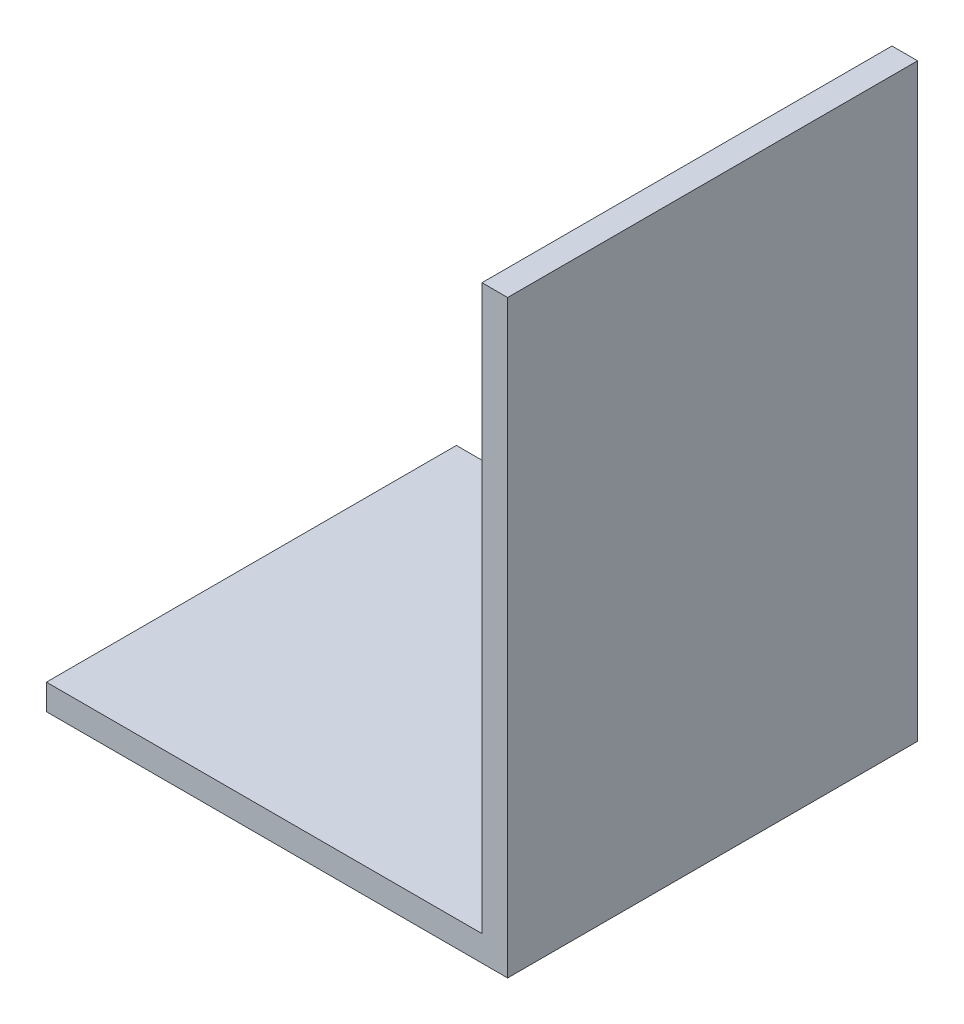
ISO-10303-21;
HEADER;
FILE_DESCRIPTION(('STEP AP214'),'2;1');
FILE_NAME('part.step','',(''),(''),'','','');
FILE_SCHEMA(('AUTOMOTIVE_DESIGN { 1 0 10303 214 1 1 1 1 }'));
ENDSEC;
DATA;
#1=APPLICATION_CONTEXT('core data for automotive mechanical design processes');
#2=APPLICATION_PROTOCOL_DEFINITION('international standard','automotive_design',2000,#1);
#3=PRODUCT_CONTEXT('',#1,'mechanical');
#4=PRODUCT('Part','Part','',(#3));
#5=PRODUCT_RELATED_PRODUCT_CATEGORY('part','',(#4));
#6=PRODUCT_DEFINITION_FORMATION('','',#4);
#7=PRODUCT_DEFINITION_CONTEXT('part definition',#1,'design');
#8=PRODUCT_DEFINITION('design','',#6,#7);
#9=PRODUCT_DEFINITION_SHAPE('','',#8);
#10=(LENGTH_UNIT() NAMED_UNIT(*) SI_UNIT(.MILLI.,.METRE.));
#11=(NAMED_UNIT(*) PLANE_ANGLE_UNIT() SI_UNIT($,.RADIAN.));
#12=(NAMED_UNIT(*) SI_UNIT($,.STERADIAN.) SOLID_ANGLE_UNIT());
#13=UNCERTAINTY_MEASURE_WITH_UNIT(LENGTH_MEASURE(1.E-05),#10,'distance_accuracy_value','');
#14=(GEOMETRIC_REPRESENTATION_CONTEXT(3) GLOBAL_UNCERTAINTY_ASSIGNED_CONTEXT((#13)) GLOBAL_UNIT_ASSIGNED_CONTEXT((#10,
#11,#12)) REPRESENTATION_CONTEXT('',''));
#15=CARTESIAN_POINT('',(0.,0.,0.));
#16=DIRECTION('',(0.,0.,1.));
#17=DIRECTION('',(1.,0.,0.));
#18=AXIS2_PLACEMENT_3D('',#15,#16,#17);
#19=CARTESIAN_POINT('',(126.,8.,16.));
#20=DIRECTION('',(1.,0.,0.));
#21=DIRECTION('',(0.,0.,-1.));
#22=AXIS2_PLACEMENT_3D('',#19,#20,#21);
#23=PLANE('',#22);
#24=DIRECTION('',(0.,-1.,0.));
#25=VECTOR('',#24,1.);
#26=CARTESIAN_POINT('',(126.,8.,0.));
#27=LINE('',#26,#25);
#28=CARTESIAN_POINT('',(126.,8.,0.));
#29=VERTEX_POINT('',#28);
#30=CARTESIAN_POINT('',(126.,7.,0.));
#31=VERTEX_POINT('',#30);
#32=EDGE_CURVE('E136',#29,#31,#27,.T.);
#33=ORIENTED_EDGE('',*,*,#32,.T.);
#34=DIRECTION('',(0.,0.,-1.));
#35=VECTOR('',#34,1.);
#36=CARTESIAN_POINT('',(126.,7.,16.));
#37=LINE('',#36,#35);
#38=CARTESIAN_POINT('',(126.,7.,16.));
#39=VERTEX_POINT('',#38);
#40=EDGE_CURVE('E11',#39,#31,#37,.T.);
#41=ORIENTED_EDGE('',*,*,#40,.F.);
#42=DIRECTION('',(0.,-1.,0.));
#43=VECTOR('',#42,1.);
#44=CARTESIAN_POINT('',(126.,8.,16.));
#45=LINE('',#44,#43);
#46=CARTESIAN_POINT('',(126.,8.,16.));
#47=VERTEX_POINT('',#46);
#48=EDGE_CURVE('E150',#47,#39,#45,.T.);
#49=ORIENTED_EDGE('',*,*,#48,.F.);
#50=DIRECTION('',(0.,0.,-1.));
#51=VECTOR('',#50,1.);
#52=CARTESIAN_POINT('',(126.,8.,16.));
#53=LINE('',#52,#51);
#54=EDGE_CURVE('E132',#47,#29,#53,.T.);
#55=ORIENTED_EDGE('',*,*,#54,.T.);
#56=EDGE_LOOP('',(#33,#41,#49,#55));
#57=FACE_BOUND('',#56,.T.);
#58=ADVANCED_FACE('F45',(#57),#23,.F.);
#59=CARTESIAN_POINT('',(126.,7.,16.));
#60=DIRECTION('',(0.,1.,0.));
#61=DIRECTION('',(0.,0.,1.));
#62=AXIS2_PLACEMENT_3D('',#59,#60,#61);
#63=PLANE('',#62);
#64=DIRECTION('',(1.,0.,0.));
#65=VECTOR('',#64,1.);
#66=CARTESIAN_POINT('',(126.,7.,0.));
#67=LINE('',#66,#65);
#68=CARTESIAN_POINT('',(144.,7.,0.));
#69=VERTEX_POINT('',#68);
#70=EDGE_CURVE('E140',#31,#69,#67,.T.);
#71=ORIENTED_EDGE('',*,*,#70,.T.);
#72=DIRECTION('',(0.,0.,-1.));
#73=VECTOR('',#72,1.);
#74=CARTESIAN_POINT('',(144.,7.,16.));
#75=LINE('',#74,#73);
#76=CARTESIAN_POINT('',(144.,7.,16.));
#77=VERTEX_POINT('',#76);
#78=EDGE_CURVE('E54',#77,#69,#75,.T.);
#79=ORIENTED_EDGE('',*,*,#78,.F.);
#80=DIRECTION('',(1.,0.,0.));
#81=VECTOR('',#80,1.);
#82=CARTESIAN_POINT('',(126.,7.,16.));
#83=LINE('',#82,#81);
#84=EDGE_CURVE('E99',#39,#77,#83,.T.);
#85=ORIENTED_EDGE('',*,*,#84,.F.);
#86=ORIENTED_EDGE('',*,*,#40,.T.);
#87=EDGE_LOOP('',(#71,#79,#85,#86));
#88=FACE_BOUND('',#87,.T.);
#89=ADVANCED_FACE('F177',(#88),#63,.F.);
#90=CARTESIAN_POINT('',(144.,7.,16.));
#91=DIRECTION('',(-1.,0.,0.));
#92=DIRECTION('',(0.,0.,1.));
#93=AXIS2_PLACEMENT_3D('',#90,#91,#92);
#94=PLANE('',#93);
#95=DIRECTION('',(0.,1.,0.));
#96=VECTOR('',#95,1.);
#97=CARTESIAN_POINT('',(144.,7.,0.));
#98=LINE('',#97,#96);
#99=CARTESIAN_POINT('',(144.,30.,0.));
#100=VERTEX_POINT('',#99);
#101=EDGE_CURVE('E143',#69,#100,#98,.T.);
#102=ORIENTED_EDGE('',*,*,#101,.T.);
#103=DIRECTION('',(0.,0.,-1.));
#104=VECTOR('',#103,1.);
#105=CARTESIAN_POINT('',(144.,30.,16.));
#106=LINE('',#105,#104);
#107=CARTESIAN_POINT('',(144.,30.,16.));
#108=VERTEX_POINT('',#107);
#109=EDGE_CURVE('E123',#108,#100,#106,.T.);
#110=ORIENTED_EDGE('',*,*,#109,.F.);
#111=DIRECTION('',(0.,1.,0.));
#112=VECTOR('',#111,1.);
#113=CARTESIAN_POINT('',(144.,7.,16.));
#114=LINE('',#113,#112);
#115=EDGE_CURVE('E112',#77,#108,#114,.T.);
#116=ORIENTED_EDGE('',*,*,#115,.F.);
#117=ORIENTED_EDGE('',*,*,#78,.T.);
#118=EDGE_LOOP('',(#102,#110,#116,#117));
#119=FACE_BOUND('',#118,.T.);
#120=ADVANCED_FACE('F160',(#119),#94,.F.);
#121=CARTESIAN_POINT('',(144.,30.,16.));
#122=DIRECTION('',(0.,-1.,0.));
#123=DIRECTION('',(0.,0.,-1.));
#124=AXIS2_PLACEMENT_3D('',#121,#122,#123);
#125=PLANE('',#124);
#126=DIRECTION('',(-1.,0.,0.));
#127=VECTOR('',#126,1.);
#128=CARTESIAN_POINT('',(144.,30.,0.));
#129=LINE('',#128,#127);
#130=CARTESIAN_POINT('',(143.,30.,0.));
#131=VERTEX_POINT('',#130);
#132=EDGE_CURVE('E121',#100,#131,#129,.T.);
#133=ORIENTED_EDGE('',*,*,#132,.T.);
#134=DIRECTION('',(0.,0.,-1.));
#135=VECTOR('',#134,1.);
#136=CARTESIAN_POINT('',(143.,30.,16.));
#137=LINE('',#136,#135);
#138=CARTESIAN_POINT('',(143.,30.,16.));
#139=VERTEX_POINT('',#138);
#140=EDGE_CURVE('E118',#139,#131,#137,.T.);
#141=ORIENTED_EDGE('',*,*,#140,.F.);
#142=DIRECTION('',(-1.,0.,0.));
#143=VECTOR('',#142,1.);
#144=CARTESIAN_POINT('',(144.,30.,16.));
#145=LINE('',#144,#143);
#146=EDGE_CURVE('E106',#108,#139,#145,.T.);
#147=ORIENTED_EDGE('',*,*,#146,.F.);
#148=ORIENTED_EDGE('',*,*,#109,.T.);
#149=EDGE_LOOP('',(#133,#141,#147,#148));
#150=FACE_BOUND('',#149,.T.);
#151=ADVANCED_FACE('F119',(#150),#125,.F.);
#152=CARTESIAN_POINT('',(143.,30.,16.));
#153=DIRECTION('',(1.,0.,0.));
#154=DIRECTION('',(0.,0.,-1.));
#155=AXIS2_PLACEMENT_3D('',#152,#153,#154);
#156=PLANE('',#155);
#157=DIRECTION('',(0.,-1.,0.));
#158=VECTOR('',#157,1.);
#159=CARTESIAN_POINT('',(143.,30.,0.));
#160=LINE('',#159,#158);
#161=CARTESIAN_POINT('',(143.,8.,0.));
#162=VERTEX_POINT('',#161);
#163=EDGE_CURVE('E85',#131,#162,#160,.T.);
#164=ORIENTED_EDGE('',*,*,#163,.T.);
#165=DIRECTION('',(0.,0.,-1.));
#166=VECTOR('',#165,1.);
#167=CARTESIAN_POINT('',(143.,8.,16.));
#168=LINE('',#167,#166);
#169=CARTESIAN_POINT('',(143.,8.,16.));
#170=VERTEX_POINT('',#169);
#171=EDGE_CURVE('E124',#170,#162,#168,.T.);
#172=ORIENTED_EDGE('',*,*,#171,.F.);
#173=DIRECTION('',(0.,-1.,0.));
#174=VECTOR('',#173,1.);
#175=CARTESIAN_POINT('',(143.,30.,16.));
#176=LINE('',#175,#174);
#177=EDGE_CURVE('E110',#139,#170,#176,.T.);
#178=ORIENTED_EDGE('',*,*,#177,.F.);
#179=ORIENTED_EDGE('',*,*,#140,.T.);
#180=EDGE_LOOP('',(#164,#172,#178,#179));
#181=FACE_BOUND('',#180,.T.);
#182=ADVANCED_FACE('F126',(#181),#156,.F.);
#183=CARTESIAN_POINT('',(143.,8.,16.));
#184=DIRECTION('',(0.,-1.,0.));
#185=DIRECTION('',(0.,0.,-1.));
#186=AXIS2_PLACEMENT_3D('',#183,#184,#185);
#187=PLANE('',#186);
#188=DIRECTION('',(-1.,0.,0.));
#189=VECTOR('',#188,1.);
#190=CARTESIAN_POINT('',(143.,8.,0.));
#191=LINE('',#190,#189);
#192=EDGE_CURVE('E91',#162,#29,#191,.T.);
#193=ORIENTED_EDGE('',*,*,#192,.T.);
#194=ORIENTED_EDGE('',*,*,#54,.F.);
#195=DIRECTION('',(-1.,0.,0.));
#196=VECTOR('',#195,1.);
#197=CARTESIAN_POINT('',(143.,8.,16.));
#198=LINE('',#197,#196);
#199=EDGE_CURVE('E62',#170,#47,#198,.T.);
#200=ORIENTED_EDGE('',*,*,#199,.F.);
#201=ORIENTED_EDGE('',*,*,#171,.T.);
#202=EDGE_LOOP('',(#193,#194,#200,#201));
#203=FACE_BOUND('',#202,.T.);
#204=ADVANCED_FACE('F167',(#203),#187,.F.);
#205=CARTESIAN_POINT('',(0.,0.,16.));
#206=DIRECTION('',(0.,0.,1.));
#207=DIRECTION('',(1.,0.,0.));
#208=AXIS2_PLACEMENT_3D('',#205,#206,#207);
#209=PLANE('',#208);
#210=ORIENTED_EDGE('',*,*,#48,.T.);
#211=ORIENTED_EDGE('',*,*,#84,.T.);
#212=ORIENTED_EDGE('',*,*,#115,.T.);
#213=ORIENTED_EDGE('',*,*,#146,.T.);
#214=ORIENTED_EDGE('',*,*,#177,.T.);
#215=ORIENTED_EDGE('',*,*,#199,.T.);
#216=EDGE_LOOP('',(#210,#211,#212,#213,#214,#215));
#217=FACE_BOUND('',#216,.T.);
#218=ADVANCED_FACE('F108',(#217),#209,.T.);
#219=CARTESIAN_POINT('',(0.,0.,0.));
#220=DIRECTION('',(0.,0.,1.));
#221=DIRECTION('',(1.,0.,0.));
#222=AXIS2_PLACEMENT_3D('',#219,#220,#221);
#223=PLANE('',#222);
#224=ORIENTED_EDGE('',*,*,#32,.F.);
#225=ORIENTED_EDGE('',*,*,#192,.F.);
#226=ORIENTED_EDGE('',*,*,#163,.F.);
#227=ORIENTED_EDGE('',*,*,#132,.F.);
#228=ORIENTED_EDGE('',*,*,#101,.F.);
#229=ORIENTED_EDGE('',*,*,#70,.F.);
#230=EDGE_LOOP('',(#224,#225,#226,#227,#228,#229));
#231=FACE_BOUND('',#230,.T.);
#232=ADVANCED_FACE('F163',(#231),#223,.F.);
#233=CLOSED_SHELL('',(#58,#89,#120,#151,#182,#204,#218,#232));
#234=MANIFOLD_SOLID_BREP('B2',#233);
#235=ADVANCED_BREP_SHAPE_REPRESENTATION('',(#18,#234),#14);
#236=SHAPE_DEFINITION_REPRESENTATION(#9,#235);
ENDSEC;
END-ISO-10303-21;
